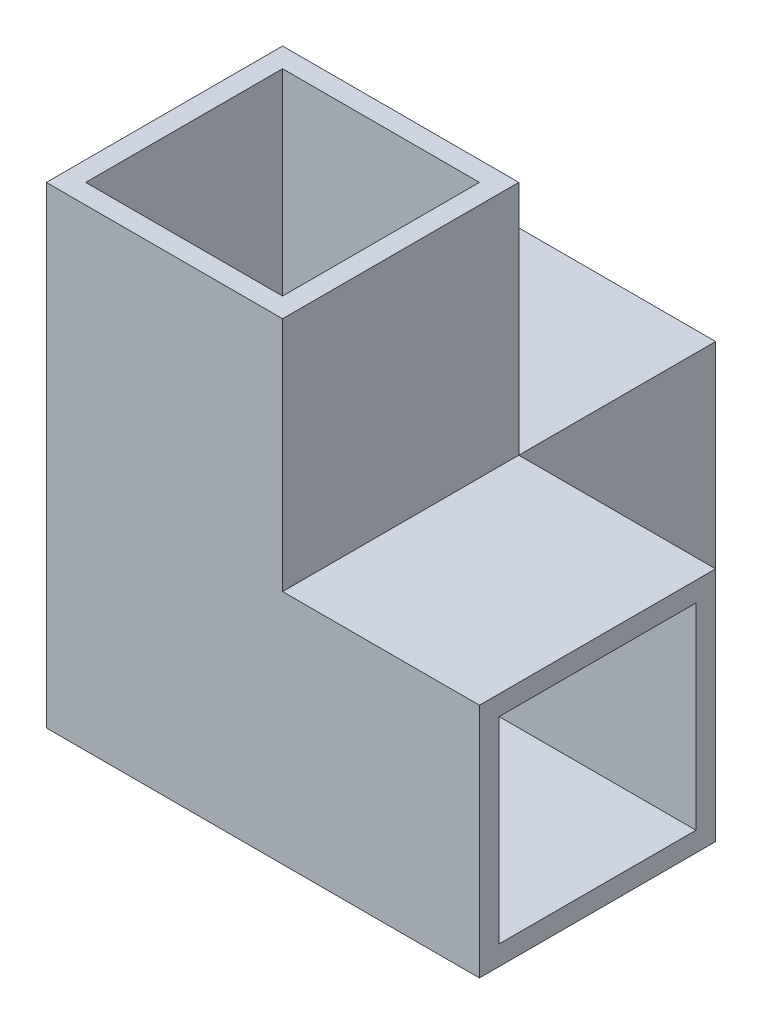
ISO-10303-21;
HEADER;
FILE_DESCRIPTION(('STEP AP214'),'2;1');
FILE_NAME('part.step','',(''),(''),'','','');
FILE_SCHEMA(('AUTOMOTIVE_DESIGN { 1 0 10303 214 1 1 1 1 }'));
ENDSEC;
DATA;
#1=APPLICATION_CONTEXT('core data for automotive mechanical design processes');
#2=APPLICATION_PROTOCOL_DEFINITION('international standard','automotive_design',2000,#1);
#3=PRODUCT_CONTEXT('',#1,'mechanical');
#4=PRODUCT('Part','Part','',(#3));
#5=PRODUCT_RELATED_PRODUCT_CATEGORY('part','',(#4));
#6=PRODUCT_DEFINITION_FORMATION('','',#4);
#7=PRODUCT_DEFINITION_CONTEXT('part definition',#1,'design');
#8=PRODUCT_DEFINITION('design','',#6,#7);
#9=PRODUCT_DEFINITION_SHAPE('','',#8);
#10=(LENGTH_UNIT() NAMED_UNIT(*) SI_UNIT(.MILLI.,.METRE.));
#11=(NAMED_UNIT(*) PLANE_ANGLE_UNIT() SI_UNIT($,.RADIAN.));
#12=(NAMED_UNIT(*) SI_UNIT($,.STERADIAN.) SOLID_ANGLE_UNIT());
#13=UNCERTAINTY_MEASURE_WITH_UNIT(LENGTH_MEASURE(1.E-05),#10,'distance_accuracy_value','');
#14=(GEOMETRIC_REPRESENTATION_CONTEXT(3) GLOBAL_UNCERTAINTY_ASSIGNED_CONTEXT((#13)) GLOBAL_UNIT_ASSIGNED_CONTEXT((#10,
#11,#12)) REPRESENTATION_CONTEXT('',''));
#15=CARTESIAN_POINT('',(0.,0.,0.));
#16=DIRECTION('',(0.,0.,1.));
#17=DIRECTION('',(1.,0.,0.));
#18=AXIS2_PLACEMENT_3D('',#15,#16,#17);
#19=CARTESIAN_POINT('',(3.99999999999999,4.,-44.));
#20=DIRECTION('',(0.,-1.,0.));
#21=DIRECTION('',(0.,0.,-1.));
#22=AXIS2_PLACEMENT_3D('',#19,#20,#21);
#23=PLANE('',#22);
#24=DIRECTION('',(0.,0.,-1.));
#25=VECTOR('',#24,1.);
#26=CARTESIAN_POINT('',(3.99999999999999,4.,-44.));
#27=LINE('',#26,#25);
#28=CARTESIAN_POINT('',(3.99999999999999,4.,-48.));
#29=VERTEX_POINT('',#28);
#30=CARTESIAN_POINT('',(4.00000000000005,4.,-88.));
#31=VERTEX_POINT('',#30);
#32=EDGE_CURVE('E200',#29,#31,#27,.T.);
#33=ORIENTED_EDGE('',*,*,#32,.F.);
#34=DIRECTION('',(1.,0.,0.));
#35=VECTOR('',#34,1.);
#36=CARTESIAN_POINT('',(3.99999999999999,4.,-48.));
#37=LINE('',#36,#35);
#38=CARTESIAN_POINT('',(44.,4.,-48.));
#39=VERTEX_POINT('',#38);
#40=EDGE_CURVE('E344',#29,#39,#37,.T.);
#41=ORIENTED_EDGE('',*,*,#40,.T.);
#42=DIRECTION('',(0.,0.,-1.));
#43=VECTOR('',#42,1.);
#44=CARTESIAN_POINT('',(44.,3.99999999999999,-3.99999999999999));
#45=LINE('',#44,#43);
#46=CARTESIAN_POINT('',(44.,3.99999999999999,-88.));
#47=VERTEX_POINT('',#46);
#48=EDGE_CURVE('E214',#39,#47,#45,.T.);
#49=ORIENTED_EDGE('',*,*,#48,.T.);
#50=DIRECTION('',(-1.,0.,0.));
#51=VECTOR('',#50,1.);
#52=CARTESIAN_POINT('',(4.00000000000005,4.,-88.));
#53=LINE('',#52,#51);
#54=EDGE_CURVE('E312',#47,#31,#53,.T.);
#55=ORIENTED_EDGE('',*,*,#54,.T.);
#56=EDGE_LOOP('',(#33,#41,#49,#55));
#57=FACE_BOUND('',#56,.T.);
#58=ADVANCED_FACE('F37',(#57),#23,.F.);
#59=CARTESIAN_POINT('',(3.99999999999999,44.,-4.));
#60=DIRECTION('',(0.,0.,1.));
#61=DIRECTION('',(1.,0.,0.));
#62=AXIS2_PLACEMENT_3D('',#59,#60,#61);
#63=PLANE('',#62);
#64=DIRECTION('',(0.,1.,0.));
#65=VECTOR('',#64,1.);
#66=CARTESIAN_POINT('',(44.0000000000002,12.,-4.));
#67=LINE('',#66,#65);
#68=CARTESIAN_POINT('',(44.0000000000002,48.,-4.));
#69=VERTEX_POINT('',#68);
#70=CARTESIAN_POINT('',(44.0000000000002,96.,-4.));
#71=VERTEX_POINT('',#70);
#72=EDGE_CURVE('E194',#69,#71,#67,.T.);
#73=ORIENTED_EDGE('',*,*,#72,.F.);
#74=DIRECTION('',(-1.,0.,0.));
#75=VECTOR('',#74,1.);
#76=CARTESIAN_POINT('',(3.99999999999999,48.,-4.));
#77=LINE('',#76,#75);
#78=CARTESIAN_POINT('',(3.99999999999999,48.,-4.));
#79=VERTEX_POINT('',#78);
#80=EDGE_CURVE('E178',#69,#79,#77,.T.);
#81=ORIENTED_EDGE('',*,*,#80,.T.);
#82=DIRECTION('',(0.,-1.,0.));
#83=VECTOR('',#82,1.);
#84=CARTESIAN_POINT('',(3.99999999999999,44.,-4.));
#85=LINE('',#84,#83);
#86=CARTESIAN_POINT('',(4.00000000000001,96.,-4.));
#87=VERTEX_POINT('',#86);
#88=EDGE_CURVE('E192',#87,#79,#85,.T.);
#89=ORIENTED_EDGE('',*,*,#88,.F.);
#90=DIRECTION('',(1.,0.,0.));
#91=VECTOR('',#90,1.);
#92=CARTESIAN_POINT('',(44.0000000000002,96.,-4.));
#93=LINE('',#92,#91);
#94=EDGE_CURVE('E326',#87,#71,#93,.T.);
#95=ORIENTED_EDGE('',*,*,#94,.T.);
#96=EDGE_LOOP('',(#73,#81,#89,#95));
#97=FACE_BOUND('',#96,.T.);
#98=ADVANCED_FACE('F190',(#97),#63,.F.);
#99=CARTESIAN_POINT('',(3.99999999999999,0.,0.));
#100=DIRECTION('',(-1.,0.,0.));
#101=DIRECTION('',(0.,0.,1.));
#102=AXIS2_PLACEMENT_3D('',#99,#100,#101);
#103=PLANE('',#102);
#104=DIRECTION('',(0.,0.,1.));
#105=VECTOR('',#104,1.);
#106=CARTESIAN_POINT('',(3.99999999999999,44.,-44.));
#107=LINE('',#106,#105);
#108=CARTESIAN_POINT('',(4.00000000000005,44.,-88.));
#109=VERTEX_POINT('',#108);
#110=CARTESIAN_POINT('',(3.99999999999999,44.,-48.));
#111=VERTEX_POINT('',#110);
#112=EDGE_CURVE('E201',#109,#111,#107,.T.);
#113=ORIENTED_EDGE('',*,*,#112,.T.);
#114=DIRECTION('',(0.,-1.,0.));
#115=VECTOR('',#114,1.);
#116=CARTESIAN_POINT('',(3.99999999999999,48.,-48.));
#117=LINE('',#116,#115);
#118=EDGE_CURVE('E186',#111,#29,#117,.T.);
#119=ORIENTED_EDGE('',*,*,#118,.T.);
#120=ORIENTED_EDGE('',*,*,#32,.T.);
#121=DIRECTION('',(0.,1.,0.));
#122=VECTOR('',#121,1.);
#123=CARTESIAN_POINT('',(4.00000000000005,44.,-88.));
#124=LINE('',#123,#122);
#125=EDGE_CURVE('E320',#31,#109,#124,.T.);
#126=ORIENTED_EDGE('',*,*,#125,.T.);
#127=EDGE_LOOP('',(#113,#119,#120,#126));
#128=FACE_BOUND('',#127,.T.);
#129=ADVANCED_FACE('F351',(#128),#103,.F.);
#130=CARTESIAN_POINT('',(3.99999999999999,44.,-44.));
#131=DIRECTION('',(0.,1.,0.));
#132=DIRECTION('',(0.,0.,1.));
#133=AXIS2_PLACEMENT_3D('',#130,#131,#132);
#134=PLANE('',#133);
#135=DIRECTION('',(1.,0.,0.));
#136=VECTOR('',#135,1.);
#137=CARTESIAN_POINT('',(3.99999999999999,44.,-4.));
#138=LINE('',#137,#136);
#139=CARTESIAN_POINT('',(48.,44.,-4.));
#140=VERTEX_POINT('',#139);
#141=CARTESIAN_POINT('',(88.,44.,-4.));
#142=VERTEX_POINT('',#141);
#143=EDGE_CURVE('E227',#140,#142,#138,.T.);
#144=ORIENTED_EDGE('',*,*,#143,.F.);
#145=DIRECTION('',(0.,0.,-1.));
#146=VECTOR('',#145,1.);
#147=CARTESIAN_POINT('',(48.,44.,-44.));
#148=LINE('',#147,#146);
#149=CARTESIAN_POINT('',(48.,44.,-44.));
#150=VERTEX_POINT('',#149);
#151=EDGE_CURVE('E52',#140,#150,#148,.T.);
#152=ORIENTED_EDGE('',*,*,#151,.T.);
#153=DIRECTION('',(1.,0.,0.));
#154=VECTOR('',#153,1.);
#155=CARTESIAN_POINT('',(3.99999999999999,44.,-44.));
#156=LINE('',#155,#154);
#157=CARTESIAN_POINT('',(88.,44.,-44.));
#158=VERTEX_POINT('',#157);
#159=EDGE_CURVE('E203',#150,#158,#156,.T.);
#160=ORIENTED_EDGE('',*,*,#159,.T.);
#161=DIRECTION('',(0.,0.,1.));
#162=VECTOR('',#161,1.);
#163=CARTESIAN_POINT('',(88.,44.,-44.));
#164=LINE('',#163,#162);
#165=EDGE_CURVE('E213',#158,#142,#164,.T.);
#166=ORIENTED_EDGE('',*,*,#165,.T.);
#167=EDGE_LOOP('',(#144,#152,#160,#166));
#168=FACE_BOUND('',#167,.T.);
#169=ADVANCED_FACE('F438',(#168),#134,.F.);
#170=CARTESIAN_POINT('',(0.,48.,0.));
#171=DIRECTION('',(0.,1.,0.));
#172=DIRECTION('',(0.,0.,1.));
#173=AXIS2_PLACEMENT_3D('',#170,#171,#172);
#174=PLANE('',#173);
#175=DIRECTION('',(0.,0.,-1.));
#176=VECTOR('',#175,1.);
#177=CARTESIAN_POINT('',(48.,48.,-48.));
#178=LINE('',#177,#176);
#179=CARTESIAN_POINT('',(48.,48.,0.));
#180=VERTEX_POINT('',#179);
#181=CARTESIAN_POINT('',(48.,48.,-48.));
#182=VERTEX_POINT('',#181);
#183=EDGE_CURVE('E224',#180,#182,#178,.T.);
#184=ORIENTED_EDGE('',*,*,#183,.F.);
#185=DIRECTION('',(1.,0.,0.));
#186=VECTOR('',#185,1.);
#187=CARTESIAN_POINT('',(0.,48.,0.));
#188=LINE('',#187,#186);
#189=CARTESIAN_POINT('',(88.,48.,0.));
#190=VERTEX_POINT('',#189);
#191=EDGE_CURVE('E268',#180,#190,#188,.T.);
#192=ORIENTED_EDGE('',*,*,#191,.T.);
#193=DIRECTION('',(0.,0.,-1.));
#194=VECTOR('',#193,1.);
#195=CARTESIAN_POINT('',(88.,48.,-48.));
#196=LINE('',#195,#194);
#197=CARTESIAN_POINT('',(88.,48.,-48.));
#198=VERTEX_POINT('',#197);
#199=EDGE_CURVE('E254',#190,#198,#196,.T.);
#200=ORIENTED_EDGE('',*,*,#199,.T.);
#201=DIRECTION('',(-1.,0.,0.));
#202=VECTOR('',#201,1.);
#203=CARTESIAN_POINT('',(48.,48.,-48.));
#204=LINE('',#203,#202);
#205=EDGE_CURVE('E257',#198,#182,#204,.T.);
#206=ORIENTED_EDGE('',*,*,#205,.T.);
#207=EDGE_LOOP('',(#184,#192,#200,#206));
#208=FACE_BOUND('',#207,.T.);
#209=ADVANCED_FACE('F383',(#208),#174,.T.);
#210=CARTESIAN_POINT('',(88.,48.,-48.));
#211=DIRECTION('',(-1.,0.,0.));
#212=DIRECTION('',(0.,0.,1.));
#213=AXIS2_PLACEMENT_3D('',#210,#211,#212);
#214=PLANE('',#213);
#215=ORIENTED_EDGE('',*,*,#165,.F.);
#216=DIRECTION('',(0.,1.,0.));
#217=VECTOR('',#216,1.);
#218=CARTESIAN_POINT('',(88.,44.,-44.));
#219=LINE('',#218,#217);
#220=CARTESIAN_POINT('',(88.,4.,-44.));
#221=VERTEX_POINT('',#220);
#222=EDGE_CURVE('E210',#221,#158,#219,.T.);
#223=ORIENTED_EDGE('',*,*,#222,.F.);
#224=DIRECTION('',(0.,0.,-1.));
#225=VECTOR('',#224,1.);
#226=CARTESIAN_POINT('',(88.,4.,-44.));
#227=LINE('',#226,#225);
#228=CARTESIAN_POINT('',(88.,3.99999999999999,-4.));
#229=VERTEX_POINT('',#228);
#230=EDGE_CURVE('E206',#229,#221,#227,.T.);
#231=ORIENTED_EDGE('',*,*,#230,.F.);
#232=DIRECTION('',(0.,-1.,0.));
#233=VECTOR('',#232,1.);
#234=CARTESIAN_POINT('',(88.,44.,-4.));
#235=LINE('',#234,#233);
#236=EDGE_CURVE('E217',#142,#229,#235,.T.);
#237=ORIENTED_EDGE('',*,*,#236,.F.);
#238=EDGE_LOOP('',(#215,#223,#231,#237));
#239=FACE_BOUND('',#238,.T.);
#240=DIRECTION('',(0.,0.,-1.));
#241=VECTOR('',#240,1.);
#242=CARTESIAN_POINT('',(88.,0.,-48.));
#243=LINE('',#242,#241);
#244=CARTESIAN_POINT('',(88.,0.,0.));
#245=VERTEX_POINT('',#244);
#246=CARTESIAN_POINT('',(88.,0.,-48.));
#247=VERTEX_POINT('',#246);
#248=EDGE_CURVE('E253',#245,#247,#243,.T.);
#249=ORIENTED_EDGE('',*,*,#248,.T.);
#250=DIRECTION('',(0.,-1.,0.));
#251=VECTOR('',#250,1.);
#252=CARTESIAN_POINT('',(88.,48.,-48.));
#253=LINE('',#252,#251);
#254=EDGE_CURVE('E296',#198,#247,#253,.T.);
#255=ORIENTED_EDGE('',*,*,#254,.F.);
#256=ORIENTED_EDGE('',*,*,#199,.F.);
#257=DIRECTION('',(0.,-1.,0.));
#258=VECTOR('',#257,1.);
#259=CARTESIAN_POINT('',(88.,48.,0.));
#260=LINE('',#259,#258);
#261=EDGE_CURVE('E270',#190,#245,#260,.T.);
#262=ORIENTED_EDGE('',*,*,#261,.T.);
#263=EDGE_LOOP('',(#249,#255,#256,#262));
#264=FACE_BOUND('',#263,.T.);
#265=ADVANCED_FACE('F39',(#239,#264),#214,.F.);
#266=CARTESIAN_POINT('',(48.,48.,-48.));
#267=DIRECTION('',(0.,0.,1.));
#268=DIRECTION('',(1.,0.,0.));
#269=AXIS2_PLACEMENT_3D('',#266,#267,#268);
#270=PLANE('',#269);
#271=DIRECTION('',(-1.,0.,0.));
#272=VECTOR('',#271,1.);
#273=CARTESIAN_POINT('',(48.,0.,-48.));
#274=LINE('',#273,#272);
#275=CARTESIAN_POINT('',(48.,0.,-48.));
#276=VERTEX_POINT('',#275);
#277=EDGE_CURVE('E273',#247,#276,#274,.T.);
#278=ORIENTED_EDGE('',*,*,#277,.T.);
#279=DIRECTION('',(0.,-1.,0.));
#280=VECTOR('',#279,1.);
#281=CARTESIAN_POINT('',(48.,48.,-48.));
#282=LINE('',#281,#280);
#283=EDGE_CURVE('E293',#182,#276,#282,.T.);
#284=ORIENTED_EDGE('',*,*,#283,.F.);
#285=ORIENTED_EDGE('',*,*,#205,.F.);
#286=ORIENTED_EDGE('',*,*,#254,.T.);
#287=EDGE_LOOP('',(#278,#284,#285,#286));
#288=FACE_BOUND('',#287,.T.);
#289=ADVANCED_FACE('F401',(#288),#270,.F.);
#290=CARTESIAN_POINT('',(48.,48.,-88.));
#291=DIRECTION('',(-1.,0.,0.));
#292=DIRECTION('',(0.,0.,1.));
#293=AXIS2_PLACEMENT_3D('',#290,#291,#292);
#294=PLANE('',#293);
#295=DIRECTION('',(0.,0.,-1.));
#296=VECTOR('',#295,1.);
#297=CARTESIAN_POINT('',(48.,0.,-88.));
#298=LINE('',#297,#296);
#299=CARTESIAN_POINT('',(48.,0.,-88.));
#300=VERTEX_POINT('',#299);
#301=EDGE_CURVE('E275',#276,#300,#298,.T.);
#302=ORIENTED_EDGE('',*,*,#301,.T.);
#303=DIRECTION('',(0.,-1.,0.));
#304=VECTOR('',#303,1.);
#305=CARTESIAN_POINT('',(48.,48.,-88.));
#306=LINE('',#305,#304);
#307=CARTESIAN_POINT('',(48.,48.,-88.));
#308=VERTEX_POINT('',#307);
#309=EDGE_CURVE('E290',#308,#300,#306,.T.);
#310=ORIENTED_EDGE('',*,*,#309,.F.);
#311=DIRECTION('',(0.,0.,-1.));
#312=VECTOR('',#311,1.);
#313=CARTESIAN_POINT('',(48.,48.,-88.));
#314=LINE('',#313,#312);
#315=EDGE_CURVE('E261',#182,#308,#314,.T.);
#316=ORIENTED_EDGE('',*,*,#315,.F.);
#317=ORIENTED_EDGE('',*,*,#283,.T.);
#318=EDGE_LOOP('',(#302,#310,#316,#317));
#319=FACE_BOUND('',#318,.T.);
#320=ADVANCED_FACE('F360',(#319),#294,.F.);
#321=CARTESIAN_POINT('',(0.,48.,-88.));
#322=DIRECTION('',(0.,0.,1.));
#323=DIRECTION('',(1.,0.,0.));
#324=AXIS2_PLACEMENT_3D('',#321,#322,#323);
#325=PLANE('',#324);
#326=DIRECTION('',(1.,0.,0.));
#327=VECTOR('',#326,1.);
#328=CARTESIAN_POINT('',(4.00000000000005,44.,-88.));
#329=LINE('',#328,#327);
#330=CARTESIAN_POINT('',(44.,44.,-88.));
#331=VERTEX_POINT('',#330);
#332=EDGE_CURVE('E310',#109,#331,#329,.T.);
#333=ORIENTED_EDGE('',*,*,#332,.F.);
#334=ORIENTED_EDGE('',*,*,#125,.F.);
#335=ORIENTED_EDGE('',*,*,#54,.F.);
#336=DIRECTION('',(0.,-1.,0.));
#337=VECTOR('',#336,1.);
#338=CARTESIAN_POINT('',(44.,44.,-88.));
#339=LINE('',#338,#337);
#340=EDGE_CURVE('E315',#331,#47,#339,.T.);
#341=ORIENTED_EDGE('',*,*,#340,.F.);
#342=EDGE_LOOP('',(#333,#334,#335,#341));
#343=FACE_BOUND('',#342,.T.);
#344=DIRECTION('',(-1.,0.,0.));
#345=VECTOR('',#344,1.);
#346=CARTESIAN_POINT('',(0.,0.,-88.));
#347=LINE('',#346,#345);
#348=CARTESIAN_POINT('',(0.,0.,-88.));
#349=VERTEX_POINT('',#348);
#350=EDGE_CURVE('E277',#300,#349,#347,.T.);
#351=ORIENTED_EDGE('',*,*,#350,.T.);
#352=DIRECTION('',(0.,-1.,0.));
#353=VECTOR('',#352,1.);
#354=CARTESIAN_POINT('',(0.,48.,-88.));
#355=LINE('',#354,#353);
#356=CARTESIAN_POINT('',(0.,48.,-88.));
#357=VERTEX_POINT('',#356);
#358=EDGE_CURVE('E287',#357,#349,#355,.T.);
#359=ORIENTED_EDGE('',*,*,#358,.F.);
#360=DIRECTION('',(-1.,0.,0.));
#361=VECTOR('',#360,1.);
#362=CARTESIAN_POINT('',(0.,48.,-88.));
#363=LINE('',#362,#361);
#364=EDGE_CURVE('E263',#308,#357,#363,.T.);
#365=ORIENTED_EDGE('',*,*,#364,.F.);
#366=ORIENTED_EDGE('',*,*,#309,.T.);
#367=EDGE_LOOP('',(#351,#359,#365,#366));
#368=FACE_BOUND('',#367,.T.);
#369=ADVANCED_FACE('F356',(#343,#368),#325,.F.);
#370=CARTESIAN_POINT('',(0.,48.,-88.));
#371=DIRECTION('',(1.,0.,0.));
#372=DIRECTION('',(0.,0.,-1.));
#373=AXIS2_PLACEMENT_3D('',#370,#371,#372);
#374=PLANE('',#373);
#375=DIRECTION('',(0.,0.,1.));
#376=VECTOR('',#375,1.);
#377=CARTESIAN_POINT('',(0.,0.,-88.));
#378=LINE('',#377,#376);
#379=CARTESIAN_POINT('',(0.,0.,0.));
#380=VERTEX_POINT('',#379);
#381=EDGE_CURVE('E279',#349,#380,#378,.T.);
#382=ORIENTED_EDGE('',*,*,#381,.T.);
#383=DIRECTION('',(0.,-1.,0.));
#384=VECTOR('',#383,1.);
#385=CARTESIAN_POINT('',(0.,48.,0.));
#386=LINE('',#385,#384);
#387=CARTESIAN_POINT('',(0.,96.,0.));
#388=VERTEX_POINT('',#387);
#389=EDGE_CURVE('E284',#388,#380,#386,.T.);
#390=ORIENTED_EDGE('',*,*,#389,.F.);
#391=DIRECTION('',(0.,0.,1.));
#392=VECTOR('',#391,1.);
#393=CARTESIAN_POINT('',(0.,96.,-48.));
#394=LINE('',#393,#392);
#395=CARTESIAN_POINT('',(0.,96.,-48.));
#396=VERTEX_POINT('',#395);
#397=EDGE_CURVE('E236',#396,#388,#394,.T.);
#398=ORIENTED_EDGE('',*,*,#397,.F.);
#399=DIRECTION('',(0.,-1.,0.));
#400=VECTOR('',#399,1.);
#401=CARTESIAN_POINT('',(0.,96.,-48.));
#402=LINE('',#401,#400);
#403=CARTESIAN_POINT('',(0.,48.,-48.));
#404=VERTEX_POINT('',#403);
#405=EDGE_CURVE('E247',#396,#404,#402,.T.);
#406=ORIENTED_EDGE('',*,*,#405,.T.);
#407=DIRECTION('',(0.,0.,1.));
#408=VECTOR('',#407,1.);
#409=CARTESIAN_POINT('',(0.,48.,-88.));
#410=LINE('',#409,#408);
#411=EDGE_CURVE('E265',#357,#404,#410,.T.);
#412=ORIENTED_EDGE('',*,*,#411,.F.);
#413=ORIENTED_EDGE('',*,*,#358,.T.);
#414=EDGE_LOOP('',(#382,#390,#398,#406,#412,#413));
#415=FACE_BOUND('',#414,.T.);
#416=ADVANCED_FACE('F359',(#415),#374,.F.);
#417=CARTESIAN_POINT('',(0.,48.,0.));
#418=DIRECTION('',(0.,0.,-1.));
#419=DIRECTION('',(-1.,0.,0.));
#420=AXIS2_PLACEMENT_3D('',#417,#418,#419);
#421=PLANE('',#420);
#422=ORIENTED_EDGE('',*,*,#191,.F.);
#423=DIRECTION('',(0.,-1.,0.));
#424=VECTOR('',#423,1.);
#425=CARTESIAN_POINT('',(48.,96.,0.));
#426=LINE('',#425,#424);
#427=CARTESIAN_POINT('',(48.,96.,0.));
#428=VERTEX_POINT('',#427);
#429=EDGE_CURVE('E241',#428,#180,#426,.T.);
#430=ORIENTED_EDGE('',*,*,#429,.F.);
#431=DIRECTION('',(1.,0.,0.));
#432=VECTOR('',#431,1.);
#433=CARTESIAN_POINT('',(48.,96.,0.));
#434=LINE('',#433,#432);
#435=EDGE_CURVE('E239',#388,#428,#434,.T.);
#436=ORIENTED_EDGE('',*,*,#435,.F.);
#437=ORIENTED_EDGE('',*,*,#389,.T.);
#438=DIRECTION('',(1.,0.,0.));
#439=VECTOR('',#438,1.);
#440=CARTESIAN_POINT('',(0.,0.,0.));
#441=LINE('',#440,#439);
#442=EDGE_CURVE('E258',#380,#245,#441,.T.);
#443=ORIENTED_EDGE('',*,*,#442,.T.);
#444=ORIENTED_EDGE('',*,*,#261,.F.);
#445=EDGE_LOOP('',(#422,#430,#436,#437,#443,#444));
#446=FACE_BOUND('',#445,.T.);
#447=ADVANCED_FACE('F377',(#446),#421,.F.);
#448=DIRECTION('',(-1.,0.,0.));
#449=VECTOR('',#448,1.);
#450=CARTESIAN_POINT('',(48.,48.,-48.));
#451=LINE('',#450,#449);
#452=EDGE_CURVE('E234',#182,#404,#451,.T.);
#453=ORIENTED_EDGE('',*,*,#452,.F.);
#454=ORIENTED_EDGE('',*,*,#315,.T.);
#455=ORIENTED_EDGE('',*,*,#364,.T.);
#456=ORIENTED_EDGE('',*,*,#411,.T.);
#457=EDGE_LOOP('',(#453,#454,#455,#456));
#458=FACE_BOUND('',#457,.T.);
#459=ADVANCED_FACE('F397',(#458),#174,.T.);
#460=CARTESIAN_POINT('',(0.,0.,0.));
#461=DIRECTION('',(0.,1.,0.));
#462=DIRECTION('',(0.,0.,1.));
#463=AXIS2_PLACEMENT_3D('',#460,#461,#462);
#464=PLANE('',#463);
#465=ORIENTED_EDGE('',*,*,#301,.F.);
#466=ORIENTED_EDGE('',*,*,#277,.F.);
#467=ORIENTED_EDGE('',*,*,#248,.F.);
#468=ORIENTED_EDGE('',*,*,#442,.F.);
#469=ORIENTED_EDGE('',*,*,#381,.F.);
#470=ORIENTED_EDGE('',*,*,#350,.F.);
#471=EDGE_LOOP('',(#465,#466,#467,#468,#469,#470));
#472=FACE_BOUND('',#471,.T.);
#473=ADVANCED_FACE('F372',(#472),#464,.F.);
#474=CARTESIAN_POINT('',(48.,96.,-48.));
#475=DIRECTION('',(-1.,0.,0.));
#476=DIRECTION('',(0.,0.,1.));
#477=AXIS2_PLACEMENT_3D('',#474,#475,#476);
#478=PLANE('',#477);
#479=ORIENTED_EDGE('',*,*,#183,.T.);
#480=DIRECTION('',(0.,-1.,0.));
#481=VECTOR('',#480,1.);
#482=CARTESIAN_POINT('',(48.,96.,-48.));
#483=LINE('',#482,#481);
#484=CARTESIAN_POINT('',(48.,96.,-48.));
#485=VERTEX_POINT('',#484);
#486=EDGE_CURVE('E250',#485,#182,#483,.T.);
#487=ORIENTED_EDGE('',*,*,#486,.F.);
#488=DIRECTION('',(0.,0.,-1.));
#489=VECTOR('',#488,1.);
#490=CARTESIAN_POINT('',(48.,96.,-48.));
#491=LINE('',#490,#489);
#492=EDGE_CURVE('E230',#428,#485,#491,.T.);
#493=ORIENTED_EDGE('',*,*,#492,.F.);
#494=ORIENTED_EDGE('',*,*,#429,.T.);
#495=EDGE_LOOP('',(#479,#487,#493,#494));
#496=FACE_BOUND('',#495,.T.);
#497=ADVANCED_FACE('F388',(#496),#478,.F.);
#498=CARTESIAN_POINT('',(48.,96.,-48.));
#499=DIRECTION('',(0.,0.,1.));
#500=DIRECTION('',(1.,0.,0.));
#501=AXIS2_PLACEMENT_3D('',#498,#499,#500);
#502=PLANE('',#501);
#503=ORIENTED_EDGE('',*,*,#452,.T.);
#504=ORIENTED_EDGE('',*,*,#405,.F.);
#505=DIRECTION('',(-1.,0.,0.));
#506=VECTOR('',#505,1.);
#507=CARTESIAN_POINT('',(48.,96.,-48.));
#508=LINE('',#507,#506);
#509=EDGE_CURVE('E233',#485,#396,#508,.T.);
#510=ORIENTED_EDGE('',*,*,#509,.F.);
#511=ORIENTED_EDGE('',*,*,#486,.T.);
#512=EDGE_LOOP('',(#503,#504,#510,#511));
#513=FACE_BOUND('',#512,.T.);
#514=ADVANCED_FACE('F395',(#513),#502,.F.);
#515=CARTESIAN_POINT('',(0.,96.,0.));
#516=DIRECTION('',(0.,-1.,0.));
#517=DIRECTION('',(0.,0.,-1.));
#518=AXIS2_PLACEMENT_3D('',#515,#516,#517);
#519=PLANE('',#518);
#520=DIRECTION('',(-1.,0.,0.));
#521=VECTOR('',#520,1.);
#522=CARTESIAN_POINT('',(44.0000000000002,96.,-44.));
#523=LINE('',#522,#521);
#524=CARTESIAN_POINT('',(44.0000000000002,96.,-44.));
#525=VERTEX_POINT('',#524);
#526=CARTESIAN_POINT('',(4.,96.,-44.));
#527=VERTEX_POINT('',#526);
#528=EDGE_CURVE('E331',#525,#527,#523,.T.);
#529=ORIENTED_EDGE('',*,*,#528,.F.);
#530=DIRECTION('',(0.,0.,-1.));
#531=VECTOR('',#530,1.);
#532=CARTESIAN_POINT('',(44.0000000000002,96.,-44.));
#533=LINE('',#532,#531);
#534=EDGE_CURVE('E334',#71,#525,#533,.T.);
#535=ORIENTED_EDGE('',*,*,#534,.F.);
#536=ORIENTED_EDGE('',*,*,#94,.F.);
#537=DIRECTION('',(0.,0.,1.));
#538=VECTOR('',#537,1.);
#539=CARTESIAN_POINT('',(4.,96.,-44.));
#540=LINE('',#539,#538);
#541=EDGE_CURVE('E198',#527,#87,#540,.T.);
#542=ORIENTED_EDGE('',*,*,#541,.F.);
#543=EDGE_LOOP('',(#529,#535,#536,#542));
#544=FACE_BOUND('',#543,.T.);
#545=ORIENTED_EDGE('',*,*,#492,.T.);
#546=ORIENTED_EDGE('',*,*,#509,.T.);
#547=ORIENTED_EDGE('',*,*,#397,.T.);
#548=ORIENTED_EDGE('',*,*,#435,.T.);
#549=EDGE_LOOP('',(#545,#546,#547,#548));
#550=FACE_BOUND('',#549,.T.);
#551=ADVANCED_FACE('F391',(#544,#550),#519,.F.);
#552=CARTESIAN_POINT('',(3.99999999999999,44.,-44.));
#553=DIRECTION('',(0.,0.,-1.));
#554=DIRECTION('',(0.,1.,0.));
#555=AXIS2_PLACEMENT_3D('',#552,#553,#554);
#556=PLANE('',#555);
#557=ORIENTED_EDGE('',*,*,#159,.F.);
#558=DIRECTION('',(0.,-1.,0.));
#559=VECTOR('',#558,1.);
#560=CARTESIAN_POINT('',(48.,44.,-44.));
#561=LINE('',#560,#559);
#562=CARTESIAN_POINT('',(48.,4.,-44.));
#563=VERTEX_POINT('',#562);
#564=EDGE_CURVE('E338',#150,#563,#561,.T.);
#565=ORIENTED_EDGE('',*,*,#564,.T.);
#566=DIRECTION('',(1.,0.,0.));
#567=VECTOR('',#566,1.);
#568=CARTESIAN_POINT('',(3.99999999999999,4.,-44.));
#569=LINE('',#568,#567);
#570=EDGE_CURVE('E222',#563,#221,#569,.T.);
#571=ORIENTED_EDGE('',*,*,#570,.T.);
#572=ORIENTED_EDGE('',*,*,#222,.T.);
#573=EDGE_LOOP('',(#557,#565,#571,#572));
#574=FACE_BOUND('',#573,.T.);
#575=ADVANCED_FACE('F420',(#574),#556,.F.);
#576=ORIENTED_EDGE('',*,*,#570,.F.);
#577=DIRECTION('',(0.,0.,1.));
#578=VECTOR('',#577,1.);
#579=CARTESIAN_POINT('',(48.,4.,-44.));
#580=LINE('',#579,#578);
#581=CARTESIAN_POINT('',(48.,4.,-4.));
#582=VERTEX_POINT('',#581);
#583=EDGE_CURVE('E341',#563,#582,#580,.T.);
#584=ORIENTED_EDGE('',*,*,#583,.T.);
#585=DIRECTION('',(1.,0.,0.));
#586=VECTOR('',#585,1.);
#587=CARTESIAN_POINT('',(3.99999999999999,3.99999999999999,-4.));
#588=LINE('',#587,#586);
#589=EDGE_CURVE('E225',#582,#229,#588,.T.);
#590=ORIENTED_EDGE('',*,*,#589,.T.);
#591=ORIENTED_EDGE('',*,*,#230,.T.);
#592=EDGE_LOOP('',(#576,#584,#590,#591));
#593=FACE_BOUND('',#592,.T.);
#594=ADVANCED_FACE('F411',(#593),#23,.F.);
#595=ORIENTED_EDGE('',*,*,#589,.F.);
#596=DIRECTION('',(0.,1.,0.));
#597=VECTOR('',#596,1.);
#598=CARTESIAN_POINT('',(48.,44.,-4.));
#599=LINE('',#598,#597);
#600=EDGE_CURVE('E11',#582,#140,#599,.T.);
#601=ORIENTED_EDGE('',*,*,#600,.T.);
#602=ORIENTED_EDGE('',*,*,#143,.T.);
#603=ORIENTED_EDGE('',*,*,#236,.T.);
#604=EDGE_LOOP('',(#595,#601,#602,#603));
#605=FACE_BOUND('',#604,.T.);
#606=ADVANCED_FACE('F417',(#605),#63,.F.);
#607=DIRECTION('',(0.,0.,-1.));
#608=VECTOR('',#607,1.);
#609=CARTESIAN_POINT('',(44.,44.,-3.99999999999999));
#610=LINE('',#609,#608);
#611=CARTESIAN_POINT('',(44.,44.,-48.));
#612=VERTEX_POINT('',#611);
#613=EDGE_CURVE('E304',#612,#331,#610,.T.);
#614=ORIENTED_EDGE('',*,*,#613,.F.);
#615=DIRECTION('',(-1.,0.,0.));
#616=VECTOR('',#615,1.);
#617=CARTESIAN_POINT('',(3.99999999999999,44.,-48.));
#618=LINE('',#617,#616);
#619=EDGE_CURVE('E59',#612,#111,#618,.T.);
#620=ORIENTED_EDGE('',*,*,#619,.T.);
#621=ORIENTED_EDGE('',*,*,#112,.F.);
#622=ORIENTED_EDGE('',*,*,#332,.T.);
#623=EDGE_LOOP('',(#614,#620,#621,#622));
#624=FACE_BOUND('',#623,.T.);
#625=ADVANCED_FACE('F308',(#624),#134,.F.);
#626=ORIENTED_EDGE('',*,*,#88,.T.);
#627=DIRECTION('',(0.,0.,-1.));
#628=VECTOR('',#627,1.);
#629=CARTESIAN_POINT('',(3.99999999999999,48.,0.));
#630=LINE('',#629,#628);
#631=CARTESIAN_POINT('',(3.99999999999999,48.,-44.));
#632=VERTEX_POINT('',#631);
#633=EDGE_CURVE('E175',#79,#632,#630,.T.);
#634=ORIENTED_EDGE('',*,*,#633,.T.);
#635=DIRECTION('',(0.,1.,0.));
#636=VECTOR('',#635,1.);
#637=CARTESIAN_POINT('',(4.,12.,-44.));
#638=LINE('',#637,#636);
#639=EDGE_CURVE('E325',#632,#527,#638,.T.);
#640=ORIENTED_EDGE('',*,*,#639,.T.);
#641=ORIENTED_EDGE('',*,*,#541,.T.);
#642=EDGE_LOOP('',(#626,#634,#640,#641));
#643=FACE_BOUND('',#642,.T.);
#644=ADVANCED_FACE('F196',(#643),#103,.F.);
#645=CARTESIAN_POINT('',(44.,44.,-3.99999999999999));
#646=DIRECTION('',(1.,0.,0.));
#647=DIRECTION('',(0.,1.,0.));
#648=AXIS2_PLACEMENT_3D('',#645,#646,#647);
#649=PLANE('',#648);
#650=ORIENTED_EDGE('',*,*,#48,.F.);
#651=DIRECTION('',(0.,1.,0.));
#652=VECTOR('',#651,1.);
#653=CARTESIAN_POINT('',(44.,44.,-48.));
#654=LINE('',#653,#652);
#655=EDGE_CURVE('E45',#39,#612,#654,.T.);
#656=ORIENTED_EDGE('',*,*,#655,.T.);
#657=ORIENTED_EDGE('',*,*,#613,.T.);
#658=ORIENTED_EDGE('',*,*,#340,.T.);
#659=EDGE_LOOP('',(#650,#656,#657,#658));
#660=FACE_BOUND('',#659,.T.);
#661=ADVANCED_FACE('F302',(#660),#649,.F.);
#662=CARTESIAN_POINT('',(44.0000000000002,12.,-44.));
#663=DIRECTION('',(1.,0.,0.));
#664=DIRECTION('',(0.,0.,-1.));
#665=AXIS2_PLACEMENT_3D('',#662,#663,#664);
#666=PLANE('',#665);
#667=DIRECTION('',(0.,1.,0.));
#668=VECTOR('',#667,1.);
#669=CARTESIAN_POINT('',(44.0000000000002,12.,-44.));
#670=LINE('',#669,#668);
#671=CARTESIAN_POINT('',(44.0000000000002,48.,-44.));
#672=VERTEX_POINT('',#671);
#673=EDGE_CURVE('E323',#672,#525,#670,.T.);
#674=ORIENTED_EDGE('',*,*,#673,.F.);
#675=DIRECTION('',(0.,0.,1.));
#676=VECTOR('',#675,1.);
#677=CARTESIAN_POINT('',(44.0000000000002,48.,-44.));
#678=LINE('',#677,#676);
#679=EDGE_CURVE('E185',#672,#69,#678,.T.);
#680=ORIENTED_EDGE('',*,*,#679,.T.);
#681=ORIENTED_EDGE('',*,*,#72,.T.);
#682=ORIENTED_EDGE('',*,*,#534,.T.);
#683=EDGE_LOOP('',(#674,#680,#681,#682));
#684=FACE_BOUND('',#683,.T.);
#685=ADVANCED_FACE('F455',(#684),#666,.F.);
#686=CARTESIAN_POINT('',(44.0000000000002,12.,-44.));
#687=DIRECTION('',(0.,0.,-1.));
#688=DIRECTION('',(-1.,0.,0.));
#689=AXIS2_PLACEMENT_3D('',#686,#687,#688);
#690=PLANE('',#689);
#691=ORIENTED_EDGE('',*,*,#639,.F.);
#692=DIRECTION('',(1.,0.,0.));
#693=VECTOR('',#692,1.);
#694=CARTESIAN_POINT('',(44.0000000000002,48.,-44.));
#695=LINE('',#694,#693);
#696=EDGE_CURVE('E181',#632,#672,#695,.T.);
#697=ORIENTED_EDGE('',*,*,#696,.T.);
#698=ORIENTED_EDGE('',*,*,#673,.T.);
#699=ORIENTED_EDGE('',*,*,#528,.T.);
#700=EDGE_LOOP('',(#691,#697,#698,#699));
#701=FACE_BOUND('',#700,.T.);
#702=ADVANCED_FACE('F460',(#701),#690,.F.);
#703=CARTESIAN_POINT('',(48.,48.,0.));
#704=DIRECTION('',(0.,1.,0.));
#705=DIRECTION('',(0.,0.,1.));
#706=AXIS2_PLACEMENT_3D('',#703,#704,#705);
#707=PLANE('',#706);
#708=ORIENTED_EDGE('',*,*,#80,.F.);
#709=ORIENTED_EDGE('',*,*,#679,.F.);
#710=ORIENTED_EDGE('',*,*,#696,.F.);
#711=ORIENTED_EDGE('',*,*,#633,.F.);
#712=EDGE_LOOP('',(#708,#709,#710,#711));
#713=FACE_BOUND('',#712,.T.);
#714=ADVANCED_FACE('F177',(#713),#707,.T.);
#715=CARTESIAN_POINT('',(48.,48.,-48.));
#716=DIRECTION('',(0.,0.,-1.));
#717=DIRECTION('',(-1.,0.,0.));
#718=AXIS2_PLACEMENT_3D('',#715,#716,#717);
#719=PLANE('',#718);
#720=ORIENTED_EDGE('',*,*,#40,.F.);
#721=ORIENTED_EDGE('',*,*,#118,.F.);
#722=ORIENTED_EDGE('',*,*,#619,.F.);
#723=ORIENTED_EDGE('',*,*,#655,.F.);
#724=EDGE_LOOP('',(#720,#721,#722,#723));
#725=FACE_BOUND('',#724,.T.);
#726=ADVANCED_FACE('F465',(#725),#719,.T.);
#727=CARTESIAN_POINT('',(48.,0.,0.));
#728=DIRECTION('',(1.,0.,0.));
#729=DIRECTION('',(0.,0.,-1.));
#730=AXIS2_PLACEMENT_3D('',#727,#728,#729);
#731=PLANE('',#730);
#732=ORIENTED_EDGE('',*,*,#151,.F.);
#733=ORIENTED_EDGE('',*,*,#600,.F.);
#734=ORIENTED_EDGE('',*,*,#583,.F.);
#735=ORIENTED_EDGE('',*,*,#564,.F.);
#736=EDGE_LOOP('',(#732,#733,#734,#735));
#737=FACE_BOUND('',#736,.T.);
#738=ADVANCED_FACE('F435',(#737),#731,.T.);
#739=CLOSED_SHELL('',(#58,#98,#129,#169,#209,#265,#289,#320,#369,#416,#447,#459,#473,#497,#514,
#551,#575,#594,#606,#625,#644,#661,#685,#702,#714,#726,#738));
#740=MANIFOLD_SOLID_BREP('B2',#739);
#741=ADVANCED_BREP_SHAPE_REPRESENTATION('',(#18,#740),#14);
#742=SHAPE_DEFINITION_REPRESENTATION(#9,#741);
ENDSEC;
END-ISO-10303-21;
